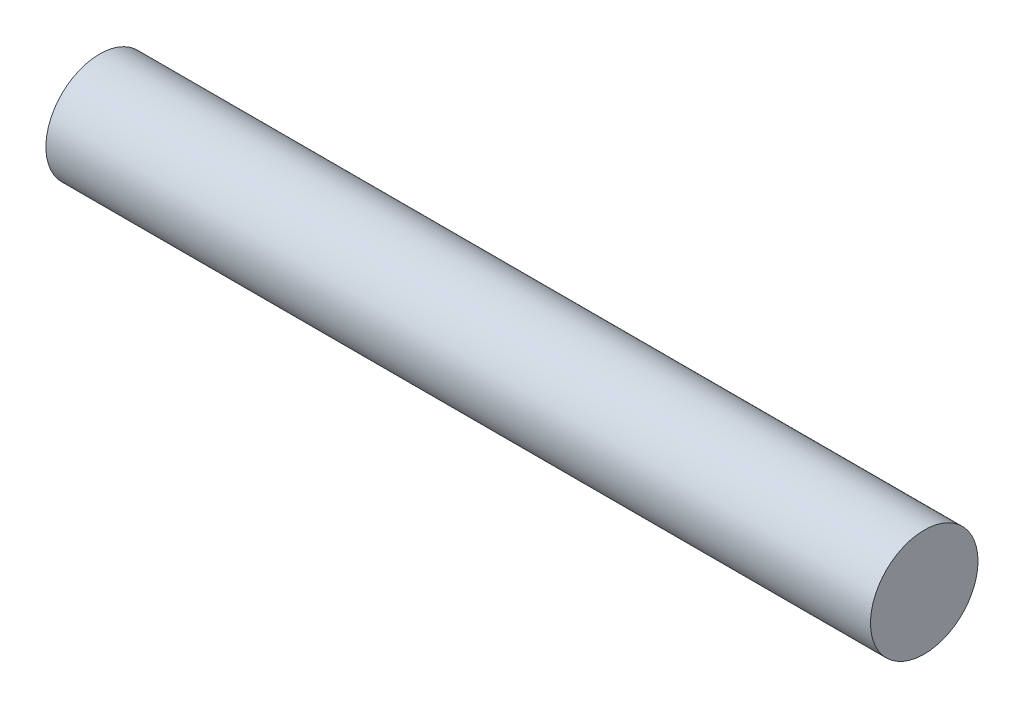
ISO-10303-21;
HEADER;
FILE_DESCRIPTION(('STEP AP214'),'2;1');
FILE_NAME('part.step','',(''),(''),'','','');
FILE_SCHEMA(('AUTOMOTIVE_DESIGN { 1 0 10303 214 1 1 1 1 }'));
ENDSEC;
DATA;
#1=APPLICATION_CONTEXT('core data for automotive mechanical design processes');
#2=APPLICATION_PROTOCOL_DEFINITION('international standard','automotive_design',2000,#1);
#3=PRODUCT_CONTEXT('',#1,'mechanical');
#4=PRODUCT('Part','Part','',(#3));
#5=PRODUCT_RELATED_PRODUCT_CATEGORY('part','',(#4));
#6=PRODUCT_DEFINITION_FORMATION('','',#4);
#7=PRODUCT_DEFINITION_CONTEXT('part definition',#1,'design');
#8=PRODUCT_DEFINITION('design','',#6,#7);
#9=PRODUCT_DEFINITION_SHAPE('','',#8);
#10=(LENGTH_UNIT() NAMED_UNIT(*) SI_UNIT(.MILLI.,.METRE.));
#11=(NAMED_UNIT(*) PLANE_ANGLE_UNIT() SI_UNIT($,.RADIAN.));
#12=(NAMED_UNIT(*) SI_UNIT($,.STERADIAN.) SOLID_ANGLE_UNIT());
#13=UNCERTAINTY_MEASURE_WITH_UNIT(LENGTH_MEASURE(1.E-05),#10,'distance_accuracy_value','');
#14=(GEOMETRIC_REPRESENTATION_CONTEXT(3) GLOBAL_UNCERTAINTY_ASSIGNED_CONTEXT((#13)) GLOBAL_UNIT_ASSIGNED_CONTEXT((#10,
#11,#12)) REPRESENTATION_CONTEXT('',''));
#15=CARTESIAN_POINT('',(0.,0.,0.));
#16=DIRECTION('',(0.,0.,1.));
#17=DIRECTION('',(1.,0.,0.));
#18=AXIS2_PLACEMENT_3D('',#15,#16,#17);
#19=CARTESIAN_POINT('',(-133.2,0.,0.));
#20=DIRECTION('',(1.,0.,0.));
#21=DIRECTION('',(0.,0.,-1.));
#22=AXIS2_PLACEMENT_3D('',#19,#20,#21);
#23=CYLINDRICAL_SURFACE('',#22,8.89);
#24=CARTESIAN_POINT('',(-133.2,0.,0.));
#25=DIRECTION('',(1.,0.,0.));
#26=DIRECTION('',(0.,0.,-1.));
#27=AXIS2_PLACEMENT_3D('',#24,#25,#26);
#28=CIRCLE('',#27,8.89);
#29=CARTESIAN_POINT('',(-133.2,0.,-8.89));
#30=VERTEX_POINT('',#29);
#31=EDGE_CURVE('E10',#30,#30,#28,.T.);
#32=CARTESIAN_POINT('',(3.19999999999996,0.,0.));
#33=DIRECTION('',(1.,0.,0.));
#34=DIRECTION('',(0.,0.,-1.));
#35=AXIS2_PLACEMENT_3D('',#32,#33,#34);
#36=CIRCLE('',#35,8.89);
#37=CARTESIAN_POINT('',(3.19999999999995,0.,-8.89));
#38=VERTEX_POINT('',#37);
#39=EDGE_CURVE('E47',#38,#38,#36,.T.);
#40=CARTESIAN_POINT('',(-133.2,0.,-8.89));
#41=CARTESIAN_POINT('',(-131.779166666667,0.,-8.89));
#42=CARTESIAN_POINT('',(-130.358333333333,0.,-8.89));
#43=CARTESIAN_POINT('',(-127.516666666667,0.,-8.89));
#44=CARTESIAN_POINT('',(-126.095833333333,0.,-8.89));
#45=CARTESIAN_POINT('',(-123.254166666667,0.,-8.89));
#46=CARTESIAN_POINT('',(-121.833333333333,0.,-8.89));
#47=CARTESIAN_POINT('',(-118.991666666667,0.,-8.89));
#48=CARTESIAN_POINT('',(-117.570833333333,0.,-8.89));
#49=CARTESIAN_POINT('',(-114.729166666667,0.,-8.89));
#50=CARTESIAN_POINT('',(-113.308333333333,0.,-8.89));
#51=CARTESIAN_POINT('',(-110.466666666667,0.,-8.89));
#52=CARTESIAN_POINT('',(-109.045833333333,0.,-8.89));
#53=CARTESIAN_POINT('',(-106.204166666667,0.,-8.89));
#54=CARTESIAN_POINT('',(-104.783333333333,0.,-8.89));
#55=CARTESIAN_POINT('',(-101.941666666667,0.,-8.89));
#56=CARTESIAN_POINT('',(-100.520833333333,0.,-8.89));
#57=CARTESIAN_POINT('',(-97.6791666666666,0.,-8.89));
#58=CARTESIAN_POINT('',(-96.2583333333333,0.,-8.89));
#59=CARTESIAN_POINT('',(-93.4166666666666,0.,-8.89));
#60=CARTESIAN_POINT('',(-91.9958333333333,0.,-8.89));
#61=CARTESIAN_POINT('',(-89.1541666666667,0.,-8.89));
#62=CARTESIAN_POINT('',(-87.7333333333333,0.,-8.89));
#63=CARTESIAN_POINT('',(-84.8916666666667,0.,-8.89));
#64=CARTESIAN_POINT('',(-83.4708333333333,0.,-8.89));
#65=CARTESIAN_POINT('',(-80.6291666666666,0.,-8.89));
#66=CARTESIAN_POINT('',(-79.2083333333333,0.,-8.89));
#67=CARTESIAN_POINT('',(-76.3666666666666,0.,-8.89));
#68=CARTESIAN_POINT('',(-74.9458333333333,0.,-8.89));
#69=CARTESIAN_POINT('',(-72.1041666666666,0.,-8.89));
#70=CARTESIAN_POINT('',(-70.6833333333333,0.,-8.89));
#71=CARTESIAN_POINT('',(-67.8416666666667,0.,-8.89));
#72=CARTESIAN_POINT('',(-66.4208333333333,0.,-8.89));
#73=CARTESIAN_POINT('',(-63.5791666666667,0.,-8.89));
#74=CARTESIAN_POINT('',(-62.1583333333333,0.,-8.89));
#75=CARTESIAN_POINT('',(-59.3166666666667,0.,-8.89));
#76=CARTESIAN_POINT('',(-57.8958333333333,0.,-8.89));
#77=CARTESIAN_POINT('',(-55.0541666666667,0.,-8.89));
#78=CARTESIAN_POINT('',(-53.6333333333333,0.,-8.89));
#79=CARTESIAN_POINT('',(-50.7916666666667,0.,-8.89));
#80=CARTESIAN_POINT('',(-49.3708333333334,0.,-8.89));
#81=CARTESIAN_POINT('',(-46.5291666666667,0.,-8.89));
#82=CARTESIAN_POINT('',(-45.1083333333334,0.,-8.89));
#83=CARTESIAN_POINT('',(-42.2666666666667,0.,-8.89));
#84=CARTESIAN_POINT('',(-40.8458333333334,0.,-8.89));
#85=CARTESIAN_POINT('',(-38.0041666666667,0.,-8.89));
#86=CARTESIAN_POINT('',(-36.5833333333334,0.,-8.89));
#87=CARTESIAN_POINT('',(-33.7416666666667,0.,-8.89));
#88=CARTESIAN_POINT('',(-32.3208333333334,0.,-8.89));
#89=CARTESIAN_POINT('',(-29.4791666666667,0.,-8.89));
#90=CARTESIAN_POINT('',(-28.0583333333334,0.,-8.89));
#91=CARTESIAN_POINT('',(-25.2166666666667,0.,-8.89));
#92=CARTESIAN_POINT('',(-23.7958333333334,0.,-8.89));
#93=CARTESIAN_POINT('',(-20.9541666666667,0.,-8.89));
#94=CARTESIAN_POINT('',(-19.5333333333334,0.,-8.89));
#95=CARTESIAN_POINT('',(-16.6916666666667,0.,-8.89));
#96=CARTESIAN_POINT('',(-15.2708333333334,0.,-8.89));
#97=CARTESIAN_POINT('',(-12.4291666666667,0.,-8.89));
#98=CARTESIAN_POINT('',(-11.0083333333334,0.,-8.89));
#99=CARTESIAN_POINT('',(-8.16666666666671,0.,-8.89));
#100=CARTESIAN_POINT('',(-6.74583333333338,0.,-8.89));
#101=CARTESIAN_POINT('',(-3.90416666666672,0.,-8.89));
#102=CARTESIAN_POINT('',(-2.48333333333338,0.,-8.89));
#103=CARTESIAN_POINT('',(0.358333333333284,0.,-8.89));
#104=CARTESIAN_POINT('',(1.77916666666662,0.,-8.89));
#105=CARTESIAN_POINT('',(3.19999999999995,0.,-8.89));
#106=B_SPLINE_CURVE_WITH_KNOTS('',3,(#40,#41,#42,#43,#44,#45,#46,#47,#48,#49,#50,#51,#52,#53,
#54,#55,#56,#57,#58,#59,#60,#61,#62,#63,#64,#65,#66,#67,#68,#69,#70,#71,#72,#73,#74,#75,#76,#77,
#78,#79,#80,#81,#82,#83,#84,#85,#86,#87,#88,#89,#90,#91,#92,#93,#94,#95,#96,#97,#98,#99,#100,
#101,#102,#103,#104,#105),.UNSPECIFIED.,.F.,.F.,(4,2,2,2,2,2,2,2,2,2,2,2,2,2,2,2,2,2,2,2,2,2,2,
2,2,2,2,2,2,2,2,2,4),(0.,4.26249999999997,8.52499999999998,12.7875,17.05,21.3125,25.575,29.8375,
34.1,38.3625,42.6249999999999,46.8874999999999,51.1499999999999,55.4124999999999,
59.6749999999999,63.9374999999999,68.1999999999999,72.4624999999999,76.7249999999999,
80.9874999999999,85.2499999999999,89.5124999999999,93.7749999999999,98.0374999999999,102.3,
106.5625,110.825,115.0875,119.35,123.6125,127.875,132.1375,136.4),.UNSPECIFIED.);
#107=EDGE_CURVE('BSEAM41',#30,#38,#106,.T.);
#108=ORIENTED_EDGE('',*,*,#31,.T.);
#109=ORIENTED_EDGE('',*,*,#39,.F.);
#110=ORIENTED_EDGE('',*,*,#107,.T.);
#111=ORIENTED_EDGE('',*,*,#107,.F.);
#112=EDGE_LOOP('',(#108,#110,#109,#111));
#113=FACE_BOUND('',#112,.T.);
#114=ADVANCED_FACE('F41',(#113),#23,.T.);
#115=CARTESIAN_POINT('',(-133.2,0.,0.));
#116=DIRECTION('',(1.,0.,0.));
#117=DIRECTION('',(0.,0.,-1.));
#118=AXIS2_PLACEMENT_3D('',#115,#116,#117);
#119=PLANE('',#118);
#120=ORIENTED_EDGE('',*,*,#31,.F.);
#121=EDGE_LOOP('',(#120));
#122=FACE_BOUND('',#121,.T.);
#123=ADVANCED_FACE('F56',(#122),#119,.F.);
#124=CARTESIAN_POINT('',(3.19999999999996,0.,0.));
#125=DIRECTION('',(1.,0.,0.));
#126=DIRECTION('',(0.,0.,-1.));
#127=AXIS2_PLACEMENT_3D('',#124,#125,#126);
#128=PLANE('',#127);
#129=ORIENTED_EDGE('',*,*,#39,.T.);
#130=EDGE_LOOP('',(#129));
#131=FACE_BOUND('',#130,.T.);
#132=ADVANCED_FACE('F53',(#131),#128,.T.);
#133=CLOSED_SHELL('',(#114,#123,#132));
#134=MANIFOLD_SOLID_BREP('B2',#133);
#135=ADVANCED_BREP_SHAPE_REPRESENTATION('',(#18,#134),#14);
#136=SHAPE_DEFINITION_REPRESENTATION(#9,#135);
ENDSEC;
END-ISO-10303-21;
